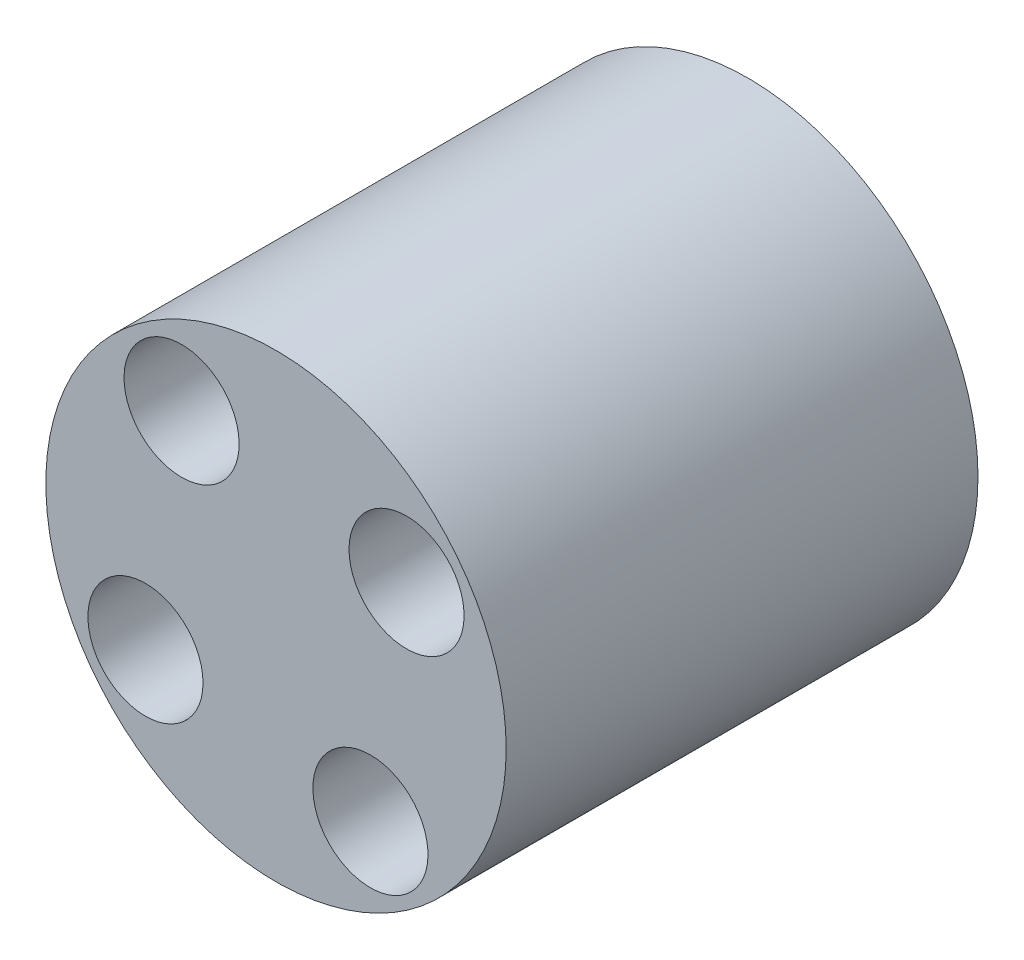
ISO-10303-21;
HEADER;
FILE_DESCRIPTION(('STEP AP214'),'2;1');
FILE_NAME('part.step','',(''),(''),'','','');
FILE_SCHEMA(('AUTOMOTIVE_DESIGN { 1 0 10303 214 1 1 1 1 }'));
ENDSEC;
DATA;
#1=APPLICATION_CONTEXT('core data for automotive mechanical design processes');
#2=APPLICATION_PROTOCOL_DEFINITION('international standard','automotive_design',2000,#1);
#3=PRODUCT_CONTEXT('',#1,'mechanical');
#4=PRODUCT('Part','Part','',(#3));
#5=PRODUCT_RELATED_PRODUCT_CATEGORY('part','',(#4));
#6=PRODUCT_DEFINITION_FORMATION('','',#4);
#7=PRODUCT_DEFINITION_CONTEXT('part definition',#1,'design');
#8=PRODUCT_DEFINITION('design','',#6,#7);
#9=PRODUCT_DEFINITION_SHAPE('','',#8);
#10=(LENGTH_UNIT() NAMED_UNIT(*) SI_UNIT(.MILLI.,.METRE.));
#11=(NAMED_UNIT(*) PLANE_ANGLE_UNIT() SI_UNIT($,.RADIAN.));
#12=(NAMED_UNIT(*) SI_UNIT($,.STERADIAN.) SOLID_ANGLE_UNIT());
#13=UNCERTAINTY_MEASURE_WITH_UNIT(LENGTH_MEASURE(1.E-05),#10,'distance_accuracy_value','');
#14=(GEOMETRIC_REPRESENTATION_CONTEXT(3) GLOBAL_UNCERTAINTY_ASSIGNED_CONTEXT((#13)) GLOBAL_UNIT_ASSIGNED_CONTEXT((#10,
#11,#12)) REPRESENTATION_CONTEXT('',''));
#15=CARTESIAN_POINT('',(0.,0.,0.));
#16=DIRECTION('',(0.,0.,1.));
#17=DIRECTION('',(1.,0.,0.));
#18=AXIS2_PLACEMENT_3D('',#15,#16,#17);
#19=CARTESIAN_POINT('',(0.,0.,35.));
#20=DIRECTION('',(0.,0.,-1.));
#21=DIRECTION('',(-1.,0.,0.));
#22=AXIS2_PLACEMENT_3D('',#19,#20,#21);
#23=CYLINDRICAL_SURFACE('',#22,20.);
#24=CARTESIAN_POINT('',(0.,0.,0.));
#25=DIRECTION('',(0.,0.,1.));
#26=DIRECTION('',(1.,0.,0.));
#27=AXIS2_PLACEMENT_3D('',#24,#25,#26);
#28=CIRCLE('',#27,20.);
#29=CARTESIAN_POINT('',(20.,0.,0.));
#30=VERTEX_POINT('',#29);
#31=EDGE_CURVE('E10',#30,#30,#28,.T.);
#32=ORIENTED_EDGE('',*,*,#31,.T.);
#33=EDGE_LOOP('',(#32));
#34=FACE_BOUND('',#33,.T.);
#35=CARTESIAN_POINT('',(0.,0.,41.));
#36=DIRECTION('',(0.,0.,1.));
#37=DIRECTION('',(1.,0.,0.));
#38=AXIS2_PLACEMENT_3D('',#35,#36,#37);
#39=CIRCLE('',#38,20.);
#40=CARTESIAN_POINT('',(20.,0.,41.));
#41=VERTEX_POINT('',#40);
#42=EDGE_CURVE('E50',#41,#41,#39,.T.);
#43=ORIENTED_EDGE('',*,*,#42,.F.);
#44=EDGE_LOOP('',(#43));
#45=FACE_BOUND('',#44,.T.);
#46=ADVANCED_FACE('F43',(#34,#45),#23,.T.);
#47=CARTESIAN_POINT('',(0.,0.,0.));
#48=DIRECTION('',(0.,0.,1.));
#49=DIRECTION('',(1.,0.,0.));
#50=AXIS2_PLACEMENT_3D('',#47,#48,#49);
#51=PLANE('',#50);
#52=CARTESIAN_POINT('',(-8.205274881255,11.3434326428575,0.));
#53=DIRECTION('',(0.,0.,-1.));
#54=DIRECTION('',(0.,-1.,0.));
#55=AXIS2_PLACEMENT_3D('',#52,#53,#54);
#56=CIRCLE('',#55,5.);
#57=CARTESIAN_POINT('',(-8.20527488125498,6.34343264285753,0.));
#58=VERTEX_POINT('',#57);
#59=EDGE_CURVE('E83',#58,#58,#56,.T.);
#60=ORIENTED_EDGE('',*,*,#59,.F.);
#61=EDGE_LOOP('',(#60));
#62=FACE_BOUND('',#61,.T.);
#63=CARTESIAN_POINT('',(-11.3434326428576,-8.20527488125496,0.));
#64=DIRECTION('',(0.,0.,-1.));
#65=DIRECTION('',(1.,0.,0.));
#66=AXIS2_PLACEMENT_3D('',#63,#64,#65);
#67=CIRCLE('',#66,5.);
#68=CARTESIAN_POINT('',(-6.34343264285756,-8.20527488125496,0.));
#69=VERTEX_POINT('',#68);
#70=EDGE_CURVE('E75',#69,#69,#67,.T.);
#71=ORIENTED_EDGE('',*,*,#70,.F.);
#72=EDGE_LOOP('',(#71));
#73=FACE_BOUND('',#72,.T.);
#74=CARTESIAN_POINT('',(8.20527488125508,-11.3434326428575,0.));
#75=DIRECTION('',(0.,0.,-1.));
#76=DIRECTION('',(0.,1.,0.));
#77=AXIS2_PLACEMENT_3D('',#74,#75,#76);
#78=CIRCLE('',#77,5.);
#79=CARTESIAN_POINT('',(8.20527488125503,-6.34343264285747,0.));
#80=VERTEX_POINT('',#79);
#81=EDGE_CURVE('E67',#80,#80,#78,.T.);
#82=ORIENTED_EDGE('',*,*,#81,.F.);
#83=EDGE_LOOP('',(#82));
#84=FACE_BOUND('',#83,.T.);
#85=CARTESIAN_POINT('',(11.3434326428576,8.20527488125496,0.));
#86=DIRECTION('',(0.,0.,-1.));
#87=DIRECTION('',(-1.,0.,0.));
#88=AXIS2_PLACEMENT_3D('',#85,#86,#87);
#89=CIRCLE('',#88,5.);
#90=CARTESIAN_POINT('',(6.34343264285756,8.20527488125496,0.));
#91=VERTEX_POINT('',#90);
#92=EDGE_CURVE('E60',#91,#91,#89,.T.);
#93=ORIENTED_EDGE('',*,*,#92,.F.);
#94=EDGE_LOOP('',(#93));
#95=FACE_BOUND('',#94,.T.);
#96=ORIENTED_EDGE('',*,*,#31,.F.);
#97=EDGE_LOOP('',(#96));
#98=FACE_BOUND('',#97,.T.);
#99=ADVANCED_FACE('F101',(#62,#73,#84,#95,#98),#51,.F.);
#100=CARTESIAN_POINT('',(0.,0.,41.));
#101=DIRECTION('',(0.,0.,1.));
#102=DIRECTION('',(1.,0.,0.));
#103=AXIS2_PLACEMENT_3D('',#100,#101,#102);
#104=PLANE('',#103);
#105=CARTESIAN_POINT('',(-8.205274881255,11.3434326428575,41.));
#106=DIRECTION('',(0.,0.,-1.));
#107=DIRECTION('',(0.,-1.,0.));
#108=AXIS2_PLACEMENT_3D('',#105,#106,#107);
#109=CIRCLE('',#108,5.);
#110=CARTESIAN_POINT('',(-8.20527488125498,6.34343264285753,41.));
#111=VERTEX_POINT('',#110);
#112=EDGE_CURVE('E65',#111,#111,#109,.T.);
#113=ORIENTED_EDGE('',*,*,#112,.T.);
#114=EDGE_LOOP('',(#113));
#115=FACE_BOUND('',#114,.T.);
#116=CARTESIAN_POINT('',(-11.3434326428576,-8.20527488125496,41.));
#117=DIRECTION('',(0.,0.,-1.));
#118=DIRECTION('',(1.,0.,0.));
#119=AXIS2_PLACEMENT_3D('',#116,#117,#118);
#120=CIRCLE('',#119,5.);
#121=CARTESIAN_POINT('',(-6.34343264285756,-8.20527488125496,41.));
#122=VERTEX_POINT('',#121);
#123=EDGE_CURVE('E79',#122,#122,#120,.T.);
#124=ORIENTED_EDGE('',*,*,#123,.T.);
#125=EDGE_LOOP('',(#124));
#126=FACE_BOUND('',#125,.T.);
#127=CARTESIAN_POINT('',(8.20527488125508,-11.3434326428575,41.));
#128=DIRECTION('',(0.,0.,-1.));
#129=DIRECTION('',(0.,1.,0.));
#130=AXIS2_PLACEMENT_3D('',#127,#128,#129);
#131=CIRCLE('',#130,5.);
#132=CARTESIAN_POINT('',(8.20527488125503,-6.34343264285747,41.));
#133=VERTEX_POINT('',#132);
#134=EDGE_CURVE('E71',#133,#133,#131,.T.);
#135=ORIENTED_EDGE('',*,*,#134,.T.);
#136=EDGE_LOOP('',(#135));
#137=FACE_BOUND('',#136,.T.);
#138=CARTESIAN_POINT('',(11.3434326428576,8.20527488125496,41.));
#139=DIRECTION('',(0.,0.,-1.));
#140=DIRECTION('',(-1.,0.,0.));
#141=AXIS2_PLACEMENT_3D('',#138,#139,#140);
#142=CIRCLE('',#141,5.);
#143=CARTESIAN_POINT('',(6.34343264285756,8.20527488125496,41.));
#144=VERTEX_POINT('',#143);
#145=EDGE_CURVE('E55',#144,#144,#142,.T.);
#146=ORIENTED_EDGE('',*,*,#145,.T.);
#147=EDGE_LOOP('',(#146));
#148=FACE_BOUND('',#147,.T.);
#149=ORIENTED_EDGE('',*,*,#42,.T.);
#150=EDGE_LOOP('',(#149));
#151=FACE_BOUND('',#150,.T.);
#152=ADVANCED_FACE('F91',(#115,#126,#137,#148,#151),#104,.T.);
#153=CARTESIAN_POINT('',(11.3434326428576,8.20527488125496,41.));
#154=DIRECTION('',(0.,0.,-1.));
#155=DIRECTION('',(-1.,0.,0.));
#156=AXIS2_PLACEMENT_3D('',#153,#154,#155);
#157=CYLINDRICAL_SURFACE('',#156,5.);
#158=ORIENTED_EDGE('',*,*,#145,.F.);
#159=EDGE_LOOP('',(#158));
#160=FACE_BOUND('',#159,.T.);
#161=ORIENTED_EDGE('',*,*,#92,.T.);
#162=EDGE_LOOP('',(#161));
#163=FACE_BOUND('',#162,.T.);
#164=ADVANCED_FACE('F111',(#160,#163),#157,.F.);
#165=CARTESIAN_POINT('',(8.20527488125508,-11.3434326428575,41.));
#166=DIRECTION('',(0.,0.,-1.));
#167=DIRECTION('',(-1.,0.,0.));
#168=AXIS2_PLACEMENT_3D('',#165,#166,#167);
#169=CYLINDRICAL_SURFACE('',#168,5.);
#170=ORIENTED_EDGE('',*,*,#134,.F.);
#171=EDGE_LOOP('',(#170));
#172=FACE_BOUND('',#171,.T.);
#173=ORIENTED_EDGE('',*,*,#81,.T.);
#174=EDGE_LOOP('',(#173));
#175=FACE_BOUND('',#174,.T.);
#176=ADVANCED_FACE('F113',(#172,#175),#169,.F.);
#177=CARTESIAN_POINT('',(-11.3434326428576,-8.20527488125496,41.));
#178=DIRECTION('',(0.,0.,-1.));
#179=DIRECTION('',(-1.,0.,0.));
#180=AXIS2_PLACEMENT_3D('',#177,#178,#179);
#181=CYLINDRICAL_SURFACE('',#180,5.);
#182=ORIENTED_EDGE('',*,*,#123,.F.);
#183=EDGE_LOOP('',(#182));
#184=FACE_BOUND('',#183,.T.);
#185=ORIENTED_EDGE('',*,*,#70,.T.);
#186=EDGE_LOOP('',(#185));
#187=FACE_BOUND('',#186,.T.);
#188=ADVANCED_FACE('F97',(#184,#187),#181,.F.);
#189=CARTESIAN_POINT('',(-8.205274881255,11.3434326428575,41.));
#190=DIRECTION('',(0.,0.,-1.));
#191=DIRECTION('',(-1.,0.,0.));
#192=AXIS2_PLACEMENT_3D('',#189,#190,#191);
#193=CYLINDRICAL_SURFACE('',#192,5.);
#194=ORIENTED_EDGE('',*,*,#112,.F.);
#195=EDGE_LOOP('',(#194));
#196=FACE_BOUND('',#195,.T.);
#197=ORIENTED_EDGE('',*,*,#59,.T.);
#198=EDGE_LOOP('',(#197));
#199=FACE_BOUND('',#198,.T.);
#200=ADVANCED_FACE('F94',(#196,#199),#193,.F.);
#201=CLOSED_SHELL('',(#46,#99,#152,#164,#176,#188,#200));
#202=MANIFOLD_SOLID_BREP('B2',#201);
#203=ADVANCED_BREP_SHAPE_REPRESENTATION('',(#18,#202),#14);
#204=SHAPE_DEFINITION_REPRESENTATION(#9,#203);
ENDSEC;
END-ISO-10303-21;
